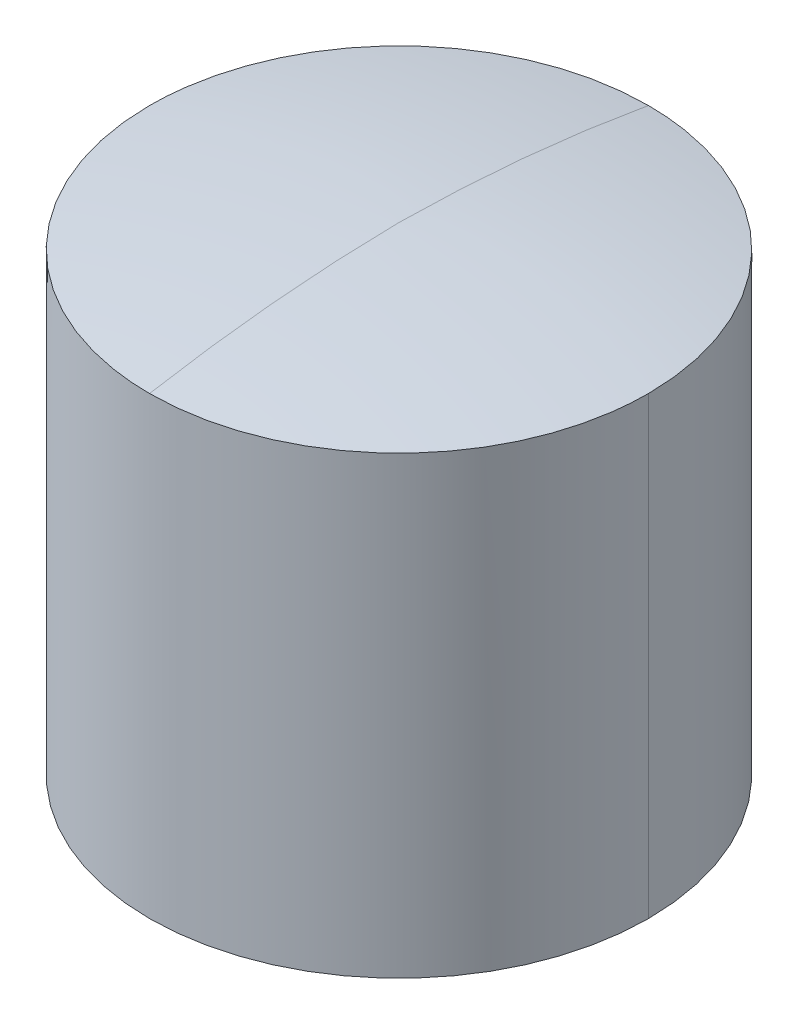
ISO-10303-21;
HEADER;
FILE_DESCRIPTION(('STEP AP214'),'2;1');
FILE_NAME('part.step','',(''),(''),'','','');
FILE_SCHEMA(('AUTOMOTIVE_DESIGN { 1 0 10303 214 1 1 1 1 }'));
ENDSEC;
DATA;
#1=APPLICATION_CONTEXT('core data for automotive mechanical design processes');
#2=APPLICATION_PROTOCOL_DEFINITION('international standard','automotive_design',2000,#1);
#3=PRODUCT_CONTEXT('',#1,'mechanical');
#4=PRODUCT('Part','Part','',(#3));
#5=PRODUCT_RELATED_PRODUCT_CATEGORY('part','',(#4));
#6=PRODUCT_DEFINITION_FORMATION('','',#4);
#7=PRODUCT_DEFINITION_CONTEXT('part definition',#1,'design');
#8=PRODUCT_DEFINITION('design','',#6,#7);
#9=PRODUCT_DEFINITION_SHAPE('','',#8);
#10=(LENGTH_UNIT() NAMED_UNIT(*) SI_UNIT(.MILLI.,.METRE.));
#11=(NAMED_UNIT(*) PLANE_ANGLE_UNIT() SI_UNIT($,.RADIAN.));
#12=(NAMED_UNIT(*) SI_UNIT($,.STERADIAN.) SOLID_ANGLE_UNIT());
#13=UNCERTAINTY_MEASURE_WITH_UNIT(LENGTH_MEASURE(1.E-05),#10,'distance_accuracy_value','');
#14=(GEOMETRIC_REPRESENTATION_CONTEXT(3) GLOBAL_UNCERTAINTY_ASSIGNED_CONTEXT((#13)) GLOBAL_UNIT_ASSIGNED_CONTEXT((#10,
#11,#12)) REPRESENTATION_CONTEXT('',''));
#15=CARTESIAN_POINT('',(0.,0.,0.));
#16=DIRECTION('',(0.,0.,1.));
#17=DIRECTION('',(1.,0.,0.));
#18=AXIS2_PLACEMENT_3D('',#15,#16,#17);
#19=CARTESIAN_POINT('',(-0.288346986931226,1.,-0.011565059006402));
#20=DIRECTION('',(0.,-1.,0.));
#21=DIRECTION('',(1.,0.,0.));
#22=AXIS2_PLACEMENT_3D('',#19,#20,#21);
#23=PLANE('',#22);
#24=CARTESIAN_POINT('',(-0.288346986931226,1.,-0.0115650590064185));
#25=DIRECTION('',(0.,1.,0.));
#26=DIRECTION('',(-1.,0.,0.));
#27=AXIS2_PLACEMENT_3D('',#24,#25,#26);
#28=CIRCLE('',#27,5.);
#29=CARTESIAN_POINT('',(-5.28834698693123,1.,-0.0115650590064188));
#30=VERTEX_POINT('',#29);
#31=CARTESIAN_POINT('',(4.71165301306877,1.,-0.0115650590064181));
#32=VERTEX_POINT('',#31);
#33=EDGE_CURVE('E79',#30,#32,#28,.T.);
#34=ORIENTED_EDGE('',*,*,#33,.F.);
#35=CARTESIAN_POINT('',(-0.288346986931226,1.,-0.0115650590064185));
#36=DIRECTION('',(0.,1.,0.));
#37=DIRECTION('',(0.,0.,-1.));
#38=AXIS2_PLACEMENT_3D('',#35,#36,#37);
#39=CIRCLE('',#38,5.);
#40=CARTESIAN_POINT('',(-0.288346986931225,1.,-5.01156505900646));
#41=VERTEX_POINT('',#40);
#42=EDGE_CURVE('E73',#41,#30,#39,.T.);
#43=ORIENTED_EDGE('',*,*,#42,.F.);
#44=CARTESIAN_POINT('',(-0.288346986931226,1.,-0.0115650590064185));
#45=DIRECTION('',(0.,1.,0.));
#46=DIRECTION('',(1.,0.,0.));
#47=AXIS2_PLACEMENT_3D('',#44,#45,#46);
#48=CIRCLE('',#47,5.);
#49=EDGE_CURVE('E75',#32,#41,#48,.T.);
#50=ORIENTED_EDGE('',*,*,#49,.F.);
#51=EDGE_LOOP('',(#34,#43,#50));
#52=FACE_BOUND('',#51,.T.);
#53=ADVANCED_FACE('F16',(#52),#23,.T.);
#54=CARTESIAN_POINT('',(-0.288346986931226,-268.,-0.011565059006402));
#55=DIRECTION('',(0.,1.,0.));
#56=DIRECTION('',(-1.,0.,0.));
#57=AXIS2_PLACEMENT_3D('',#54,#55,#56);
#58=CYLINDRICAL_SURFACE('',#57,5.);
#59=CARTESIAN_POINT('',(-5.28834698693123,-5.75000000000003,-0.0115650590063971));
#60=DIRECTION('',(0.,1.,0.));
#61=VECTOR('',#60,1.);
#62=LINE('',#59,#61);
#63=CARTESIAN_POINT('',(-5.28834698693123,-5.75,-0.0115650590064179));
#64=VERTEX_POINT('',#63);
#65=EDGE_CURVE('E98',#64,#30,#62,.T.);
#66=ORIENTED_EDGE('',*,*,#65,.F.);
#67=CARTESIAN_POINT('',(4.71165301306877,-5.75,-0.0115650590064183));
#68=CARTESIAN_POINT('',(4.71165301306877,-5.75,-0.503744254499697));
#69=CARTESIAN_POINT('',(4.61557941508492,-5.75,-0.987016669087057));
#70=CARTESIAN_POINT('',(4.51966618800781,-5.75,-1.46948238092824));
#71=CARTESIAN_POINT('',(4.3310506756252,-5.75,-1.92498222083186));
#72=CARTESIAN_POINT('',(4.14285600322606,-5.75,-2.37946574695157));
#73=CARTESIAN_POINT('',(3.86900107458149,-5.75,-2.78941622410442));
#74=CARTESIAN_POINT('',(3.59575717257902,-5.75,-3.19845201746933));
#75=CARTESIAN_POINT('',(3.2471869190015,-5.75,-3.54709896493915));
#76=CARTESIAN_POINT('',(2.89939439731488,-5.75,-3.89496800939823));
#77=CARTESIAN_POINT('',(2.48950417816678,-5.75,-4.16891312051913));
#78=CARTESIAN_POINT('',(2.08052850835875,-5.75,-4.44224700378221));
#79=CARTESIAN_POINT('',(1.62507017489422,-5.75,-4.63096272156284));
#80=CARTESIAN_POINT('',(1.17062806259832,-5.75,-4.81925737578359));
#81=CARTESIAN_POINT('',(0.687104623149413,-5.75,-4.91549146102255));
#82=CARTESIAN_POINT('',(0.204660023888421,-5.75,-5.01151082823518));
#83=CARTESIAN_POINT('',(-0.288346986931228,-5.75,-5.0115650590064));
#84=CARTESIAN_POINT('',(-0.780253997763,-5.75,-5.01161916877762));
#85=CARTESIAN_POINT('',(-1.26379859701187,-5.75,-4.91549146102255));
#86=CARTESIAN_POINT('',(-1.74626430885475,-5.75,-4.81957823394502));
#87=CARTESIAN_POINT('',(-2.20176414875667,-5.75,-4.63096272156284));
#88=CARTESIAN_POINT('',(-2.65624767487546,-5.75,-4.4427680491638));
#89=CARTESIAN_POINT('',(-3.06619815202924,-5.75,-4.16891312051913));
#90=CARTESIAN_POINT('',(-3.47523394539201,-5.75,-3.8956692185186));
#91=CARTESIAN_POINT('',(-3.82388089286396,-5.75,-3.54709896493914));
#92=CARTESIAN_POINT('',(-4.17174993732111,-5.75,-3.19930644325466));
#93=CARTESIAN_POINT('',(-4.44569504844395,-5.75,-2.78941622410442));
#94=CARTESIAN_POINT('',(-4.71902893170506,-5.75,-2.38044055430011));
#95=CARTESIAN_POINT('',(-4.90774464948766,-5.75,-1.92498222083186));
#96=CARTESIAN_POINT('',(-5.09603930370724,-5.75,-1.47054010853983));
#97=CARTESIAN_POINT('',(-5.19227338894738,-5.75,-0.987016669087058));
#98=CARTESIAN_POINT('',(-5.28834698693123,-5.75,-0.50429958997902));
#99=CARTESIAN_POINT('',(-5.28834698693123,-5.75,-0.0115650590064162));
#100=B_SPLINE_CURVE_WITH_KNOTS('',2,(#67,#68,#69,#70,#71,#72,#73,#74,#75,#76,#77,#78,#79,#80,
#81,#82,#83,#84,#85,#86,#87,#88,#89,#90,#91,#92,#93,#94,#95,#96,#97,#98,#99),.UNSPECIFIED.,.F.,
.F.,(3,2,2,2,2,2,2,2,2,2,2,2,2,2,2,2,3),(0.,0.0625,0.125,0.1875,0.25,0.3125,0.375,0.4375,0.5,
0.5625,0.625,0.6875,0.75,0.8125,0.875,0.9375,1.),.UNSPECIFIED.);
#101=CARTESIAN_POINT('',(4.71165301306877,-5.75,-0.0115650590064185));
#102=VERTEX_POINT('',#101);
#103=EDGE_CURVE('E92',#102,#64,#100,.T.);
#104=ORIENTED_EDGE('',*,*,#103,.F.);
#105=CARTESIAN_POINT('',(4.71165301306877,1.,-0.011565059006429));
#106=DIRECTION('',(0.,-1.,0.));
#107=VECTOR('',#106,1.);
#108=LINE('',#105,#107);
#109=EDGE_CURVE('E88',#32,#102,#108,.T.);
#110=ORIENTED_EDGE('',*,*,#109,.F.);
#111=ORIENTED_EDGE('',*,*,#49,.T.);
#112=ORIENTED_EDGE('',*,*,#42,.T.);
#113=EDGE_LOOP('',(#66,#104,#110,#111,#112));
#114=FACE_BOUND('',#113,.T.);
#115=ADVANCED_FACE('F90',(#114),#58,.F.);
#116=CARTESIAN_POINT('',(-0.288346986931226,-268.,-0.011565059006402));
#117=DIRECTION('',(0.,1.,0.));
#118=DIRECTION('',(-1.,0.,0.));
#119=AXIS2_PLACEMENT_3D('',#116,#117,#118);
#120=CYLINDRICAL_SURFACE('',#119,5.);
#121=ORIENTED_EDGE('',*,*,#65,.T.);
#122=ORIENTED_EDGE('',*,*,#33,.T.);
#123=ORIENTED_EDGE('',*,*,#109,.T.);
#124=CARTESIAN_POINT('',(-0.288346986931226,-5.75,4.9884349409936));
#125=CARTESIAN_POINT('',(0.203832208563935,-5.75,4.9884349409936));
#126=CARTESIAN_POINT('',(0.687104623149417,-5.75,4.89236134300975));
#127=CARTESIAN_POINT('',(1.16957033499308,-5.75,4.79644811593178));
#128=CARTESIAN_POINT('',(1.62507017489423,-5.75,4.60783260355003));
#129=CARTESIAN_POINT('',(2.07955370101407,-5.75,4.41963793115067));
#130=CARTESIAN_POINT('',(2.48950417816679,-5.75,4.14578300250632));
#131=CARTESIAN_POINT('',(2.89853997153073,-5.75,3.87253910050462));
#132=CARTESIAN_POINT('',(3.24718691900152,-5.75,3.52396884692633));
#133=CARTESIAN_POINT('',(3.59505596345942,-5.75,3.17617632524109));
#134=CARTESIAN_POINT('',(3.8690010745815,-5.75,2.7662861060916));
#135=CARTESIAN_POINT('',(4.14233495784376,-5.75,2.3573104362852));
#136=CARTESIAN_POINT('',(4.33105067562521,-5.75,1.90185210281904));
#137=CARTESIAN_POINT('',(4.51934532984523,-5.75,1.44740999052526));
#138=CARTESIAN_POINT('',(4.61557941508493,-5.75,0.963886551074226));
#139=CARTESIAN_POINT('',(4.71165301306877,-5.75,0.481169471965699));
#140=CARTESIAN_POINT('',(4.71165301306877,-5.75,-0.0115650590064183));
#141=B_SPLINE_CURVE_WITH_KNOTS('',2,(#124,#125,#126,#127,#128,#129,#130,#131,#132,#133,#134,
#135,#136,#137,#138,#139,#140),.UNSPECIFIED.,.F.,.F.,(3,2,2,2,2,2,2,2,3),(0.,0.125,0.25,0.375,
0.5,0.625,0.75,0.875,1.),.UNSPECIFIED.);
#142=CARTESIAN_POINT('',(-0.288346986931226,-5.75,4.98843494099359));
#143=VERTEX_POINT('',#142);
#144=EDGE_CURVE('E106',#143,#102,#141,.T.);
#145=ORIENTED_EDGE('',*,*,#144,.F.);
#146=CARTESIAN_POINT('',(-5.28834698693123,-5.75,-0.0115650590064162));
#147=CARTESIAN_POINT('',(-5.28834698693123,-5.75,0.480614136487316));
#148=CARTESIAN_POINT('',(-5.19227338894739,-5.75,0.963886551074226));
#149=CARTESIAN_POINT('',(-5.09636016186985,-5.75,1.44635226291712));
#150=CARTESIAN_POINT('',(-4.90774464948767,-5.75,1.90185210281904));
#151=CARTESIAN_POINT('',(-4.71954997708884,-5.75,2.35633562893732));
#152=CARTESIAN_POINT('',(-4.44569504844396,-5.75,2.7662861060916));
#153=CARTESIAN_POINT('',(-4.1724511464442,-5.75,3.17532189945341));
#154=CARTESIAN_POINT('',(-3.82388089286397,-5.75,3.52396884692633));
#155=CARTESIAN_POINT('',(-3.47608837117773,-5.75,3.87183789138543));
#156=CARTESIAN_POINT('',(-3.06619815202924,-5.75,4.14578300250632));
#157=CARTESIAN_POINT('',(-2.65722248222035,-5.75,4.41911688576972));
#158=CARTESIAN_POINT('',(-2.20176414875668,-5.75,4.60783260355003));
#159=CARTESIAN_POINT('',(-1.74732203646286,-5.75,4.79612725776997));
#160=CARTESIAN_POINT('',(-1.26379859701187,-5.75,4.89236134300975));
#161=CARTESIAN_POINT('',(-0.781081517903839,-5.75,4.9884349409936));
#162=CARTESIAN_POINT('',(-0.288346986931226,-5.75,4.9884349409936));
#163=B_SPLINE_CURVE_WITH_KNOTS('',2,(#146,#147,#148,#149,#150,#151,#152,#153,#154,#155,#156,
#157,#158,#159,#160,#161,#162),.UNSPECIFIED.,.F.,.F.,(3,2,2,2,2,2,2,2,3),(0.,0.125,0.25,0.375,
0.5,0.625,0.75,0.875,1.),.UNSPECIFIED.);
#164=EDGE_CURVE('E146',#64,#143,#163,.T.);
#165=ORIENTED_EDGE('',*,*,#164,.F.);
#166=EDGE_LOOP('',(#121,#122,#123,#145,#165));
#167=FACE_BOUND('',#166,.T.);
#168=ADVANCED_FACE('F102',(#167),#120,.F.);
#169=CARTESIAN_POINT('',(-0.288346986931226,-5.75,-0.011565059006402));
#170=DIRECTION('',(0.,1.,0.));
#171=DIRECTION('',(1.,0.,0.));
#172=AXIS2_PLACEMENT_3D('',#169,#170,#171);
#173=PLANE('',#172);
#174=CARTESIAN_POINT('',(-0.288346986931226,-5.75,-0.0115650590064002));
#175=DIRECTION('',(0.,1.,0.));
#176=DIRECTION('',(1.,0.,0.));
#177=AXIS2_PLACEMENT_3D('',#174,#175,#176);
#178=CIRCLE('',#177,6.);
#179=CARTESIAN_POINT('',(5.71165301306877,-5.75,-0.0115650590064016));
#180=VERTEX_POINT('',#179);
#181=CARTESIAN_POINT('',(-6.28834698693123,-5.75,-0.0115650590064002));
#182=VERTEX_POINT('',#181);
#183=EDGE_CURVE('E150',#180,#182,#178,.T.);
#184=ORIENTED_EDGE('',*,*,#183,.F.);
#185=CARTESIAN_POINT('',(-0.288346986931226,-5.75,-0.0115650590064002));
#186=DIRECTION('',(0.,1.,0.));
#187=DIRECTION('',(0.,0.,1.));
#188=AXIS2_PLACEMENT_3D('',#185,#186,#187);
#189=CIRCLE('',#188,6.);
#190=CARTESIAN_POINT('',(-0.288346986931225,-5.75,5.9884349409936));
#191=VERTEX_POINT('',#190);
#192=EDGE_CURVE('E200',#191,#180,#189,.T.);
#193=ORIENTED_EDGE('',*,*,#192,.F.);
#194=CARTESIAN_POINT('',(-0.288346986931226,-5.75,-0.0115650590064002));
#195=DIRECTION('',(0.,1.,0.));
#196=DIRECTION('',(-1.,0.,0.));
#197=AXIS2_PLACEMENT_3D('',#194,#195,#196);
#198=CIRCLE('',#197,6.);
#199=EDGE_CURVE('E179',#182,#191,#198,.T.);
#200=ORIENTED_EDGE('',*,*,#199,.F.);
#201=EDGE_LOOP('',(#184,#193,#200));
#202=FACE_BOUND('',#201,.T.);
#203=ORIENTED_EDGE('',*,*,#103,.T.);
#204=ORIENTED_EDGE('',*,*,#164,.T.);
#205=ORIENTED_EDGE('',*,*,#144,.T.);
#206=EDGE_LOOP('',(#203,#204,#205));
#207=FACE_BOUND('',#206,.T.);
#208=ADVANCED_FACE('F121',(#202,#207),#173,.F.);
#209=CARTESIAN_POINT('',(-0.288346986931226,4.25,-10.0115650590064));
#210=CARTESIAN_POINT('',(-20.2883469869313,4.25000000000003,-10.0115650590065));
#211=CARTESIAN_POINT('',(-20.2883469869313,4.25000000000003,9.98843494099358));
#212=CARTESIAN_POINT('',(-0.288346986931226,4.25,9.98843494099359));
#213=CARTESIAN_POINT('',(19.7116530130687,4.25000000000003,9.98843494099358));
#214=CARTESIAN_POINT('',(19.7116530130687,4.25000000000003,-10.0115650590065));
#215=CARTESIAN_POINT('',(-0.288346986931226,4.25,-10.0115650590064));
#216=CARTESIAN_POINT('',(-0.288346986931226,5.69235210285418,-5.0626729308068));
#217=CARTESIAN_POINT('',(-10.3905627305322,5.69235210285426,-5.06267293080678));
#218=CARTESIAN_POINT('',(-10.3905627305322,5.69235210285426,5.03954281279391));
#219=CARTESIAN_POINT('',(-0.288346986931226,5.69235210285418,5.03954281279391));
#220=CARTESIAN_POINT('',(9.81386875666946,5.69235210285426,5.03954281279391));
#221=CARTESIAN_POINT('',(9.81386875666946,5.69235210285426,-5.06267293080678));
#222=CARTESIAN_POINT('',(-0.288346986931226,5.69235210285418,-5.0626729308068));
#223=CARTESIAN_POINT('',(-0.288346986931226,5.75,-0.011565059006402));
#224=CARTESIAN_POINT('',(-0.288346986931372,5.75000000000003,-0.0115650590064471));
#225=CARTESIAN_POINT('',(-0.288346986931372,5.75000000000003,-0.0115650590064471));
#226=CARTESIAN_POINT('',(-0.288346986931226,5.75,-0.011565059006402));
#227=CARTESIAN_POINT('',(-0.288346986931372,5.75000000000003,-0.0115650590064471));
#228=CARTESIAN_POINT('',(-0.288346986931372,5.75000000000003,-0.0115650590064471));
#229=CARTESIAN_POINT('',(-0.288346986931226,5.75,-0.011565059006402));
#230=(BOUNDED_SURFACE() B_SPLINE_SURFACE(2,3,((#209,#210,#211,#212,#213,#214,#215),(#216,#217,
#218,#219,#220,#221,#222),(#223,#224,#225,#226,#227,#228,#229)),.UNSPECIFIED.,.F.,.T.,
.F.) B_SPLINE_SURFACE_WITH_KNOTS((3,3),(4,3,4),(0.,1.),(0.,0.5,1.),
.UNSPECIFIED.) GEOMETRIC_REPRESENTATION_ITEM() RATIONAL_B_SPLINE_SURFACE(((1.,0.333333333333334,
0.333333333333334,1.,0.333333333333334,0.333333333333334,1.),(1.,0.333333333333334,
0.333333333333334,1.,0.333333333333334,0.333333333333334,1.),(1.,0.333333333333334,
0.333333333333334,1.,0.333333333333334,0.333333333333334,1.))) REPRESENTATION_ITEM('') SURFACE());
#231=CARTESIAN_POINT('',(-0.288346986931226,5.18668861401745,-6.01156505900646));
#232=CARTESIAN_POINT('',(-12.2883469869315,5.1866886140175,-6.0115650590065));
#233=CARTESIAN_POINT('',(-12.2883469869315,5.1866886140175,5.9884349409936));
#234=CARTESIAN_POINT('',(-0.288346986931226,5.18668861401745,5.98843494099361));
#235=CARTESIAN_POINT('',(11.7116530130688,5.1866886140175,5.9884349409936));
#236=CARTESIAN_POINT('',(11.7116530130688,5.1866886140175,-6.0115650590065));
#237=CARTESIAN_POINT('',(-0.288346986931226,5.18668861401745,-6.01156505900646));
#238=(BOUNDED_CURVE() B_SPLINE_CURVE(3,(#231,#232,#233,#234,#235,#236,#237),.UNSPECIFIED.,.T.,
.F.) B_SPLINE_CURVE_WITH_KNOTS((4,3,4),(0.,0.5,1.),
.UNSPECIFIED.) CURVE() GEOMETRIC_REPRESENTATION_ITEM() RATIONAL_B_SPLINE_CURVE((1.,
0.333333333333334,0.333333333333334,1.,0.333333333333334,0.333333333333334,1.)) REPRESENTATION_ITEM(''));
#239=CARTESIAN_POINT('',(-0.288346986931227,5.18668861401744,-6.01156505900641));
#240=VERTEX_POINT('',#239);
#241=CARTESIAN_POINT('',(5.71165301306878,5.18668861401741,-0.011565059006403));
#242=VERTEX_POINT('',#241);
#243=EDGE_CURVE('E298',#240,#242,#238,.F.);
#244=CARTESIAN_POINT('',(-0.288346986931226,5.75,-0.011565059006402));
#245=CARTESIAN_POINT('',(-0.288346986931226,5.69235210285418,-5.0626729308068));
#246=CARTESIAN_POINT('',(-0.288346986931226,4.25,-10.0115650590064));
#247=(BOUNDED_CURVE() B_SPLINE_CURVE(2,(#244,#245,#246),.UNSPECIFIED.,.F.,
.F.) B_SPLINE_CURVE_WITH_KNOTS((3,3),(0.,1.),
.UNSPECIFIED.) CURVE() GEOMETRIC_REPRESENTATION_ITEM() RATIONAL_B_SPLINE_CURVE((1.,1.,1.)) REPRESENTATION_ITEM(''));
#248=CARTESIAN_POINT('',(-0.288346986931226,5.75,-0.011565059006402));
#249=VERTEX_POINT('',#248);
#250=EDGE_CURVE('E272',#249,#240,#247,.T.);
#251=CARTESIAN_POINT('',(-0.288346986931226,4.25,9.98843494099359));
#252=CARTESIAN_POINT('',(-0.288346986931226,5.69235210285418,5.03954281279391));
#253=CARTESIAN_POINT('',(-0.288346986931226,5.75,-0.011565059006402));
#254=(BOUNDED_CURVE() B_SPLINE_CURVE(2,(#251,#252,#253),.UNSPECIFIED.,.F.,
.F.) B_SPLINE_CURVE_WITH_KNOTS((3,3),(0.,1.),
.UNSPECIFIED.) CURVE() GEOMETRIC_REPRESENTATION_ITEM() RATIONAL_B_SPLINE_CURVE((1.,1.,1.)) REPRESENTATION_ITEM(''));
#255=CARTESIAN_POINT('',(-0.288346986931225,5.18668861401743,5.9884349409936));
#256=VERTEX_POINT('',#255);
#257=EDGE_CURVE('E212',#256,#249,#254,.T.);
#258=CARTESIAN_POINT('',(-0.288346986931226,5.18668861401745,-6.01156505900645));
#259=CARTESIAN_POINT('',(-12.2883469869315,5.1866886140175,-6.01156505900649));
#260=CARTESIAN_POINT('',(-12.2883469869315,5.1866886140175,5.9884349409936));
#261=CARTESIAN_POINT('',(-0.288346986931226,5.18668861401745,5.98843494099361));
#262=CARTESIAN_POINT('',(11.7116530130688,5.1866886140175,5.9884349409936));
#263=CARTESIAN_POINT('',(11.7116530130688,5.1866886140175,-6.01156505900649));
#264=CARTESIAN_POINT('',(-0.288346986931226,5.18668861401745,-6.01156505900645));
#265=(BOUNDED_CURVE() B_SPLINE_CURVE(3,(#258,#259,#260,#261,#262,#263,#264),.UNSPECIFIED.,.T.,
.F.) B_SPLINE_CURVE_WITH_KNOTS((4,3,4),(0.,0.5,1.),
.UNSPECIFIED.) CURVE() GEOMETRIC_REPRESENTATION_ITEM() RATIONAL_B_SPLINE_CURVE((1.,
0.333333333333334,0.333333333333334,1.,0.333333333333334,0.333333333333334,1.)) REPRESENTATION_ITEM(''));
#266=EDGE_CURVE('E265',#242,#256,#265,.F.);
#267=ORIENTED_EDGE('',*,*,#243,.F.);
#268=ORIENTED_EDGE('',*,*,#250,.F.);
#269=ORIENTED_EDGE('',*,*,#257,.F.);
#270=ORIENTED_EDGE('',*,*,#266,.F.);
#271=EDGE_LOOP('',(#267,#268,#269,#270));
#272=FACE_BOUND('',#271,.T.);
#273=ADVANCED_FACE('F354',(#272),#230,.F.);
#274=CARTESIAN_POINT('',(-0.288346986931226,4.25,-0.011565059006402));
#275=DIRECTION('',(0.,-1.,0.));
#276=DIRECTION('',(-1.,0.,0.));
#277=AXIS2_PLACEMENT_3D('',#274,#275,#276);
#278=CYLINDRICAL_SURFACE('',#277,6.);
#279=CARTESIAN_POINT('',(-0.288346986931226,5.18668861401745,-6.01156505900641));
#280=CARTESIAN_POINT('',(-12.2883469869314,5.18668861401751,-6.01156505900645));
#281=CARTESIAN_POINT('',(-12.2883469869314,5.18668861401751,5.98843494099356));
#282=CARTESIAN_POINT('',(-0.288346986931226,5.18668861401745,5.98843494099357));
#283=CARTESIAN_POINT('',(11.7116530130687,5.18668861401751,5.98843494099356));
#284=CARTESIAN_POINT('',(11.7116530130687,5.18668861401751,-6.01156505900645));
#285=CARTESIAN_POINT('',(-0.288346986931226,5.18668861401745,-6.01156505900641));
#286=(BOUNDED_CURVE() B_SPLINE_CURVE(3,(#279,#280,#281,#282,#283,#284,#285),.UNSPECIFIED.,.T.,
.F.) B_SPLINE_CURVE_WITH_KNOTS((4,3,4),(0.,0.5,1.),
.UNSPECIFIED.) CURVE() GEOMETRIC_REPRESENTATION_ITEM() RATIONAL_B_SPLINE_CURVE((1.,
0.333333333333334,0.333333333333334,1.,0.333333333333334,0.333333333333334,1.)) REPRESENTATION_ITEM(''));
#287=CARTESIAN_POINT('',(-6.28834698693123,5.18668861401743,-0.0115650590064021));
#288=VERTEX_POINT('',#287);
#289=EDGE_CURVE('E28',#240,#288,#286,.T.);
#290=ORIENTED_EDGE('',*,*,#289,.F.);
#291=ORIENTED_EDGE('',*,*,#243,.T.);
#292=CARTESIAN_POINT('',(5.71165301306877,-5.75,-0.0115650590063876));
#293=DIRECTION('',(0.,1.,0.));
#294=VECTOR('',#293,1.);
#295=LINE('',#292,#294);
#296=EDGE_CURVE('E295',#180,#242,#295,.T.);
#297=ORIENTED_EDGE('',*,*,#296,.F.);
#298=ORIENTED_EDGE('',*,*,#183,.T.);
#299=CARTESIAN_POINT('',(-6.28834698693123,5.1866886140174,-0.0115650590064273));
#300=DIRECTION('',(0.,-1.,0.));
#301=VECTOR('',#300,1.);
#302=LINE('',#299,#301);
#303=EDGE_CURVE('E36',#288,#182,#302,.T.);
#304=ORIENTED_EDGE('',*,*,#303,.F.);
#305=EDGE_LOOP('',(#290,#291,#297,#298,#304));
#306=FACE_BOUND('',#305,.T.);
#307=ADVANCED_FACE('F235',(#306),#278,.T.);
#308=CARTESIAN_POINT('',(-0.288346986931226,4.25,-0.011565059006402));
#309=DIRECTION('',(0.,-1.,0.));
#310=DIRECTION('',(-1.,0.,0.));
#311=AXIS2_PLACEMENT_3D('',#308,#309,#310);
#312=CYLINDRICAL_SURFACE('',#311,6.);
#313=ORIENTED_EDGE('',*,*,#199,.T.);
#314=ORIENTED_EDGE('',*,*,#192,.T.);
#315=ORIENTED_EDGE('',*,*,#296,.T.);
#316=ORIENTED_EDGE('',*,*,#266,.T.);
#317=CARTESIAN_POINT('',(-0.288346986931226,5.18668861401747,-6.01156505900634));
#318=CARTESIAN_POINT('',(-12.2883469869312,5.18668861401752,-6.01156505900638));
#319=CARTESIAN_POINT('',(-12.2883469869312,5.18668861401752,5.98843494099349));
#320=CARTESIAN_POINT('',(-0.288346986931226,5.18668861401747,5.9884349409935));
#321=CARTESIAN_POINT('',(11.7116530130686,5.18668861401752,5.98843494099349));
#322=CARTESIAN_POINT('',(11.7116530130686,5.18668861401752,-6.01156505900638));
#323=CARTESIAN_POINT('',(-0.288346986931226,5.18668861401747,-6.01156505900634));
#324=(BOUNDED_CURVE() B_SPLINE_CURVE(3,(#317,#318,#319,#320,#321,#322,#323),.UNSPECIFIED.,.T.,
.F.) B_SPLINE_CURVE_WITH_KNOTS((4,3,4),(0.,0.5,1.),
.UNSPECIFIED.) CURVE() GEOMETRIC_REPRESENTATION_ITEM() RATIONAL_B_SPLINE_CURVE((1.,
0.333333333333334,0.333333333333334,1.,0.333333333333334,0.333333333333334,1.)) REPRESENTATION_ITEM(''));
#325=EDGE_CURVE('E10',#288,#256,#324,.T.);
#326=ORIENTED_EDGE('',*,*,#325,.F.);
#327=ORIENTED_EDGE('',*,*,#303,.T.);
#328=EDGE_LOOP('',(#313,#314,#315,#316,#326,#327));
#329=FACE_BOUND('',#328,.T.);
#330=ADVANCED_FACE('F214',(#329),#312,.T.);
#331=CARTESIAN_POINT('',(-0.288346986931226,4.25,-10.0115650590064));
#332=CARTESIAN_POINT('',(-20.2883469869313,4.25000000000003,-10.0115650590065));
#333=CARTESIAN_POINT('',(-20.2883469869313,4.25000000000003,9.98843494099358));
#334=CARTESIAN_POINT('',(-0.288346986931226,4.25,9.98843494099359));
#335=CARTESIAN_POINT('',(19.7116530130687,4.25000000000003,9.98843494099358));
#336=CARTESIAN_POINT('',(19.7116530130687,4.25000000000003,-10.0115650590065));
#337=CARTESIAN_POINT('',(-0.288346986931226,4.25,-10.0115650590064));
#338=CARTESIAN_POINT('',(-0.288346986931226,5.69235210285418,-5.0626729308068));
#339=CARTESIAN_POINT('',(-10.3905627305322,5.69235210285426,-5.06267293080678));
#340=CARTESIAN_POINT('',(-10.3905627305322,5.69235210285426,5.03954281279391));
#341=CARTESIAN_POINT('',(-0.288346986931226,5.69235210285418,5.03954281279391));
#342=CARTESIAN_POINT('',(9.81386875666946,5.69235210285426,5.03954281279391));
#343=CARTESIAN_POINT('',(9.81386875666946,5.69235210285426,-5.06267293080678));
#344=CARTESIAN_POINT('',(-0.288346986931226,5.69235210285418,-5.0626729308068));
#345=CARTESIAN_POINT('',(-0.288346986931226,5.75,-0.011565059006402));
#346=CARTESIAN_POINT('',(-0.288346986931372,5.75000000000003,-0.0115650590064471));
#347=CARTESIAN_POINT('',(-0.288346986931372,5.75000000000003,-0.0115650590064471));
#348=CARTESIAN_POINT('',(-0.288346986931226,5.75,-0.011565059006402));
#349=CARTESIAN_POINT('',(-0.288346986931372,5.75000000000003,-0.0115650590064471));
#350=CARTESIAN_POINT('',(-0.288346986931372,5.75000000000003,-0.0115650590064471));
#351=CARTESIAN_POINT('',(-0.288346986931226,5.75,-0.011565059006402));
#352=(BOUNDED_SURFACE() B_SPLINE_SURFACE(2,3,((#331,#332,#333,#334,#335,#336,#337),(#338,#339,
#340,#341,#342,#343,#344),(#345,#346,#347,#348,#349,#350,#351)),.UNSPECIFIED.,.F.,.T.,
.F.) B_SPLINE_SURFACE_WITH_KNOTS((3,3),(4,3,4),(0.,1.),(0.,0.5,1.),
.UNSPECIFIED.) GEOMETRIC_REPRESENTATION_ITEM() RATIONAL_B_SPLINE_SURFACE(((1.,0.333333333333334,
0.333333333333334,1.,0.333333333333334,0.333333333333334,1.),(1.,0.333333333333334,
0.333333333333334,1.,0.333333333333334,0.333333333333334,1.),(1.,0.333333333333334,
0.333333333333334,1.,0.333333333333334,0.333333333333334,1.))) REPRESENTATION_ITEM('') SURFACE());
#353=ORIENTED_EDGE('',*,*,#289,.T.);
#354=ORIENTED_EDGE('',*,*,#325,.T.);
#355=ORIENTED_EDGE('',*,*,#257,.T.);
#356=ORIENTED_EDGE('',*,*,#250,.T.);
#357=EDGE_LOOP('',(#353,#354,#355,#356));
#358=FACE_BOUND('',#357,.T.);
#359=ADVANCED_FACE('F234',(#358),#352,.F.);
#360=CLOSED_SHELL('',(#53,#115,#168,#208,#273,#307,#330,#359));
#361=MANIFOLD_SOLID_BREP('B1',#360);
#362=ADVANCED_BREP_SHAPE_REPRESENTATION('',(#18,#361),#14);
#363=SHAPE_DEFINITION_REPRESENTATION(#9,#362);
ENDSEC;
END-ISO-10303-21;
